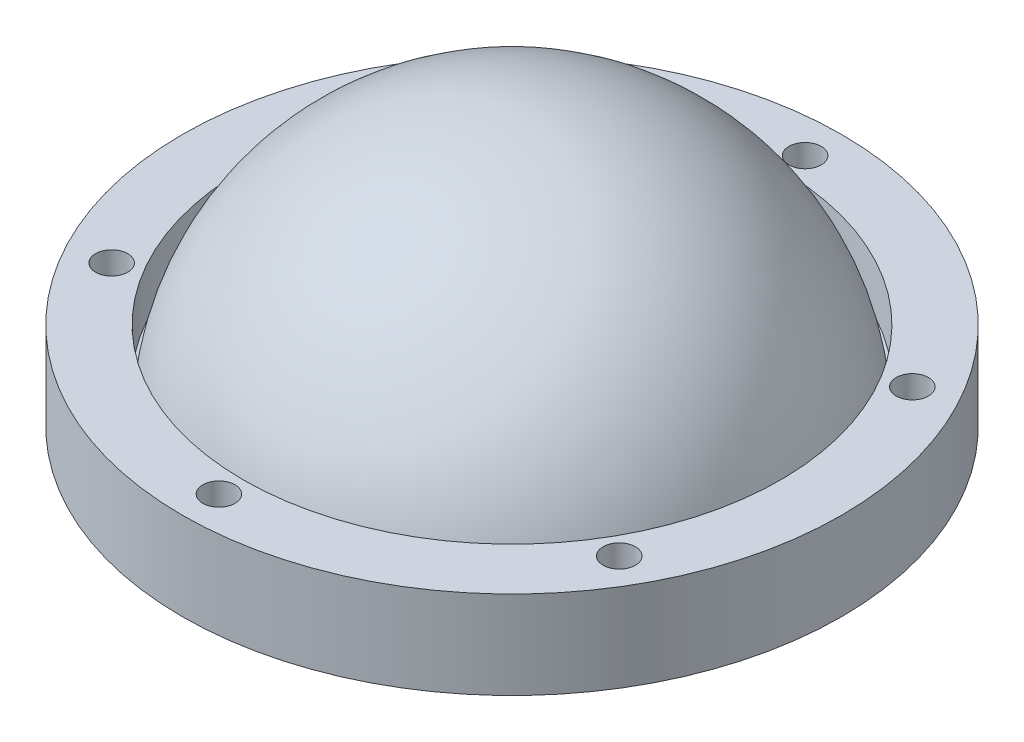
ISO-10303-21;
HEADER;
FILE_DESCRIPTION(('STEP AP214'),'2;1');
FILE_NAME('part.step','',(''),(''),'','','');
FILE_SCHEMA(('AUTOMOTIVE_DESIGN { 1 0 10303 214 1 1 1 1 }'));
ENDSEC;
DATA;
#1=APPLICATION_CONTEXT('core data for automotive mechanical design processes');
#2=APPLICATION_PROTOCOL_DEFINITION('international standard','automotive_design',2000,#1);
#3=PRODUCT_CONTEXT('',#1,'mechanical');
#4=PRODUCT('Part','Part','',(#3));
#5=PRODUCT_RELATED_PRODUCT_CATEGORY('part','',(#4));
#6=PRODUCT_DEFINITION_FORMATION('','',#4);
#7=PRODUCT_DEFINITION_CONTEXT('part definition',#1,'design');
#8=PRODUCT_DEFINITION('design','',#6,#7);
#9=PRODUCT_DEFINITION_SHAPE('','',#8);
#10=(LENGTH_UNIT() NAMED_UNIT(*) SI_UNIT(.MILLI.,.METRE.));
#11=(NAMED_UNIT(*) PLANE_ANGLE_UNIT() SI_UNIT($,.RADIAN.));
#12=(NAMED_UNIT(*) SI_UNIT($,.STERADIAN.) SOLID_ANGLE_UNIT());
#13=UNCERTAINTY_MEASURE_WITH_UNIT(LENGTH_MEASURE(1.E-05),#10,'distance_accuracy_value','');
#14=(GEOMETRIC_REPRESENTATION_CONTEXT(3) GLOBAL_UNCERTAINTY_ASSIGNED_CONTEXT((#13)) GLOBAL_UNIT_ASSIGNED_CONTEXT((#10,
#11,#12)) REPRESENTATION_CONTEXT('',''));
#15=CARTESIAN_POINT('',(0.,0.,0.));
#16=DIRECTION('',(0.,0.,1.));
#17=DIRECTION('',(1.,0.,0.));
#18=AXIS2_PLACEMENT_3D('',#15,#16,#17);
#19=CARTESIAN_POINT('',(0.,8.,0.));
#20=DIRECTION('',(0.,-1.,0.));
#21=DIRECTION('',(0.,0.,-1.));
#22=AXIS2_PLACEMENT_3D('',#19,#20,#21);
#23=CYLINDRICAL_SURFACE('',#22,67.5);
#24=CARTESIAN_POINT('',(0.,0.,0.));
#25=DIRECTION('',(0.,1.,0.));
#26=DIRECTION('',(0.,0.,1.));
#27=AXIS2_PLACEMENT_3D('',#24,#25,#26);
#28=CIRCLE('',#27,67.5);
#29=CARTESIAN_POINT('',(0.,0.,67.5));
#30=VERTEX_POINT('',#29);
#31=EDGE_CURVE('E58',#30,#30,#28,.T.);
#32=ORIENTED_EDGE('',*,*,#31,.T.);
#33=EDGE_LOOP('',(#32));
#34=FACE_BOUND('',#33,.T.);
#35=CARTESIAN_POINT('',(0.,18.,0.));
#36=DIRECTION('',(0.,1.,0.));
#37=DIRECTION('',(0.,0.,1.));
#38=AXIS2_PLACEMENT_3D('',#35,#36,#37);
#39=CIRCLE('',#38,67.5);
#40=CARTESIAN_POINT('',(0.,18.,67.5));
#41=VERTEX_POINT('',#40);
#42=EDGE_CURVE('E62',#41,#41,#39,.T.);
#43=ORIENTED_EDGE('',*,*,#42,.F.);
#44=EDGE_LOOP('',(#43));
#45=FACE_BOUND('',#44,.T.);
#46=ADVANCED_FACE('F41',(#34,#45),#23,.T.);
#47=CARTESIAN_POINT('',(-65.,0.,0.));
#48=DIRECTION('',(0.,1.,0.));
#49=DIRECTION('',(-1.,0.,0.));
#50=AXIS2_PLACEMENT_3D('',#47,#48,#49);
#51=PLANE('',#50);
#52=ORIENTED_EDGE('',*,*,#31,.F.);
#53=EDGE_LOOP('',(#52));
#54=FACE_BOUND('',#53,.T.);
#55=ADVANCED_FACE('F43',(#54),#51,.F.);
#56=CARTESIAN_POINT('',(0.,18.,0.));
#57=DIRECTION('',(0.,1.,0.));
#58=DIRECTION('',(0.,0.,1.));
#59=AXIS2_PLACEMENT_3D('',#56,#57,#58);
#60=PLANE('',#59);
#61=CARTESIAN_POINT('',(-51.961524227066,18.,30.0000000000006));
#62=DIRECTION('',(0.,1.,0.));
#63=DIRECTION('',(-0.866025403784433,0.,0.50000000000001));
#64=AXIS2_PLACEMENT_3D('',#61,#62,#63);
#65=CIRCLE('',#64,3.3);
#66=CARTESIAN_POINT('',(-54.8194080595546,18.,31.6500000000006));
#67=VERTEX_POINT('',#66);
#68=EDGE_CURVE('E81',#67,#67,#65,.T.);
#69=ORIENTED_EDGE('',*,*,#68,.F.);
#70=EDGE_LOOP('',(#69));
#71=FACE_BOUND('',#70,.T.);
#72=CARTESIAN_POINT('',(-51.9615242270666,18.,-29.9999999999995));
#73=DIRECTION('',(0.,1.,0.));
#74=DIRECTION('',(-0.866025403784443,0.,-0.499999999999992));
#75=AXIS2_PLACEMENT_3D('',#72,#73,#74);
#76=CIRCLE('',#75,3.3);
#77=CARTESIAN_POINT('',(-54.8194080595553,18.,-31.6499999999995));
#78=VERTEX_POINT('',#77);
#79=EDGE_CURVE('E87',#78,#78,#76,.T.);
#80=ORIENTED_EDGE('',*,*,#79,.F.);
#81=EDGE_LOOP('',(#80));
#82=FACE_BOUND('',#81,.T.);
#83=CARTESIAN_POINT('',(0.,18.,-60.));
#84=DIRECTION('',(0.,1.,0.));
#85=DIRECTION('',(0.,0.,-1.));
#86=AXIS2_PLACEMENT_3D('',#83,#84,#85);
#87=CIRCLE('',#86,3.3);
#88=CARTESIAN_POINT('',(0.,18.,-63.3));
#89=VERTEX_POINT('',#88);
#90=EDGE_CURVE('E93',#89,#89,#87,.T.);
#91=ORIENTED_EDGE('',*,*,#90,.F.);
#92=EDGE_LOOP('',(#91));
#93=FACE_BOUND('',#92,.T.);
#94=CARTESIAN_POINT('',(51.9615242270662,18.,-30.0000000000003));
#95=DIRECTION('',(0.,1.,0.));
#96=DIRECTION('',(0.866025403784436,0.,-0.500000000000004));
#97=AXIS2_PLACEMENT_3D('',#94,#95,#96);
#98=CIRCLE('',#97,3.3);
#99=CARTESIAN_POINT('',(54.8194080595548,18.,-31.6500000000003));
#100=VERTEX_POINT('',#99);
#101=EDGE_CURVE('E99',#100,#100,#98,.T.);
#102=ORIENTED_EDGE('',*,*,#101,.F.);
#103=EDGE_LOOP('',(#102));
#104=FACE_BOUND('',#103,.T.);
#105=CARTESIAN_POINT('',(51.9615242270664,18.,29.9999999999999));
#106=DIRECTION('',(0.,1.,0.));
#107=DIRECTION('',(0.86602540378444,0.,0.499999999999998));
#108=AXIS2_PLACEMENT_3D('',#105,#106,#107);
#109=CIRCLE('',#108,3.3);
#110=CARTESIAN_POINT('',(54.8194080595551,18.,31.6499999999999));
#111=VERTEX_POINT('',#110);
#112=EDGE_CURVE('E75',#111,#111,#109,.T.);
#113=ORIENTED_EDGE('',*,*,#112,.F.);
#114=EDGE_LOOP('',(#113));
#115=FACE_BOUND('',#114,.T.);
#116=CARTESIAN_POINT('',(0.,18.,60.));
#117=DIRECTION('',(0.,1.,0.));
#118=DIRECTION('',(0.,0.,1.));
#119=AXIS2_PLACEMENT_3D('',#116,#117,#118);
#120=CIRCLE('',#119,3.3);
#121=CARTESIAN_POINT('',(0.,18.,63.3));
#122=VERTEX_POINT('',#121);
#123=EDGE_CURVE('E69',#122,#122,#120,.T.);
#124=ORIENTED_EDGE('',*,*,#123,.F.);
#125=EDGE_LOOP('',(#124));
#126=FACE_BOUND('',#125,.T.);
#127=ORIENTED_EDGE('',*,*,#42,.T.);
#128=EDGE_LOOP('',(#127));
#129=FACE_BOUND('',#128,.T.);
#130=CARTESIAN_POINT('',(0.,18.,0.));
#131=DIRECTION('',(0.,1.,0.));
#132=DIRECTION('',(0.,0.,1.));
#133=AXIS2_PLACEMENT_3D('',#130,#131,#132);
#134=CIRCLE('',#133,55.);
#135=CARTESIAN_POINT('',(0.,18.,55.));
#136=VERTEX_POINT('',#135);
#137=EDGE_CURVE('E65',#136,#136,#134,.T.);
#138=ORIENTED_EDGE('',*,*,#137,.F.);
#139=EDGE_LOOP('',(#138));
#140=FACE_BOUND('',#139,.T.);
#141=ADVANCED_FACE('F114',(#71,#82,#93,#104,#115,#126,#129,#140),#60,.T.);
#142=CARTESIAN_POINT('',(0.,18.,0.));
#143=DIRECTION('',(0.,-1.,0.));
#144=DIRECTION('',(0.,0.,-1.));
#145=AXIS2_PLACEMENT_3D('',#142,#143,#144);
#146=CYLINDRICAL_SURFACE('',#145,55.);
#147=ORIENTED_EDGE('',*,*,#137,.T.);
#148=EDGE_LOOP('',(#147));
#149=FACE_BOUND('',#148,.T.);
#150=CARTESIAN_POINT('',(0.,8.,0.));
#151=DIRECTION('',(0.,1.,0.));
#152=DIRECTION('',(0.,0.,1.));
#153=AXIS2_PLACEMENT_3D('',#150,#151,#152);
#154=CIRCLE('',#153,55.);
#155=CARTESIAN_POINT('',(0.,8.,55.));
#156=VERTEX_POINT('',#155);
#157=EDGE_CURVE('E11',#156,#156,#154,.F.);
#158=ORIENTED_EDGE('',*,*,#157,.T.);
#159=EDGE_LOOP('',(#158));
#160=FACE_BOUND('',#159,.T.);
#161=ADVANCED_FACE('F117',(#149,#160),#146,.F.);
#162=CARTESIAN_POINT('',(0.,0.,0.));
#163=DIRECTION('',(0.,-1.,0.));
#164=DIRECTION('',(1.,0.,0.));
#165=AXIS2_PLACEMENT_3D('',#162,#163,#164);
#166=SPHERICAL_SURFACE('',#165,55.);
#167=CARTESIAN_POINT('',(0.,8.,0.));
#168=DIRECTION('',(0.,1.,0.));
#169=DIRECTION('',(0.,0.,1.));
#170=AXIS2_PLACEMENT_3D('',#167,#168,#169);
#171=CIRCLE('',#170,54.4150714416512);
#172=CARTESIAN_POINT('',(0.,8.,54.4150714416512));
#173=VERTEX_POINT('',#172);
#174=EDGE_CURVE('E53',#173,#173,#171,.T.);
#175=ORIENTED_EDGE('',*,*,#174,.T.);
#176=EDGE_LOOP('',(#175));
#177=FACE_BOUND('',#176,.T.);
#178=ADVANCED_FACE('F129',(#177),#166,.T.);
#179=CARTESIAN_POINT('',(0.,8.,0.));
#180=DIRECTION('',(0.,1.,0.));
#181=DIRECTION('',(0.,0.,1.));
#182=AXIS2_PLACEMENT_3D('',#179,#180,#181);
#183=PLANE('',#182);
#184=ORIENTED_EDGE('',*,*,#174,.F.);
#185=EDGE_LOOP('',(#184));
#186=FACE_BOUND('',#185,.T.);
#187=ORIENTED_EDGE('',*,*,#157,.F.);
#188=EDGE_LOOP('',(#187));
#189=FACE_BOUND('',#188,.T.);
#190=ADVANCED_FACE('F134',(#186,#189),#183,.T.);
#191=CARTESIAN_POINT('',(0.,3.,60.));
#192=DIRECTION('',(0.,1.,0.));
#193=DIRECTION('',(0.,0.,1.));
#194=AXIS2_PLACEMENT_3D('',#191,#192,#193);
#195=CYLINDRICAL_SURFACE('',#194,3.3);
#196=CARTESIAN_POINT('',(0.,3.,60.));
#197=DIRECTION('',(0.,1.,0.));
#198=DIRECTION('',(0.,0.,1.));
#199=AXIS2_PLACEMENT_3D('',#196,#197,#198);
#200=CIRCLE('',#199,3.3);
#201=CARTESIAN_POINT('',(0.,3.,63.3));
#202=VERTEX_POINT('',#201);
#203=EDGE_CURVE('E68',#202,#202,#200,.T.);
#204=ORIENTED_EDGE('',*,*,#203,.F.);
#205=EDGE_LOOP('',(#204));
#206=FACE_BOUND('',#205,.T.);
#207=ORIENTED_EDGE('',*,*,#123,.T.);
#208=EDGE_LOOP('',(#207));
#209=FACE_BOUND('',#208,.T.);
#210=ADVANCED_FACE('F159',(#206,#209),#195,.F.);
#211=CARTESIAN_POINT('',(0.,3.,60.));
#212=DIRECTION('',(0.,1.,0.));
#213=DIRECTION('',(0.,0.,1.));
#214=AXIS2_PLACEMENT_3D('',#211,#212,#213);
#215=PLANE('',#214);
#216=ORIENTED_EDGE('',*,*,#203,.T.);
#217=EDGE_LOOP('',(#216));
#218=FACE_BOUND('',#217,.T.);
#219=ADVANCED_FACE('F164',(#218),#215,.T.);
#220=CARTESIAN_POINT('',(51.9615242270664,3.,29.9999999999999));
#221=DIRECTION('',(0.,1.,0.));
#222=DIRECTION('',(0.,0.,1.));
#223=AXIS2_PLACEMENT_3D('',#220,#221,#222);
#224=CYLINDRICAL_SURFACE('',#223,3.3);
#225=CARTESIAN_POINT('',(51.9615242270664,3.,29.9999999999999));
#226=DIRECTION('',(0.,1.,0.));
#227=DIRECTION('',(0.86602540378444,0.,0.499999999999998));
#228=AXIS2_PLACEMENT_3D('',#225,#226,#227);
#229=CIRCLE('',#228,3.3);
#230=CARTESIAN_POINT('',(54.8194080595551,3.,31.6499999999999));
#231=VERTEX_POINT('',#230);
#232=EDGE_CURVE('E72',#231,#231,#229,.T.);
#233=ORIENTED_EDGE('',*,*,#232,.F.);
#234=EDGE_LOOP('',(#233));
#235=FACE_BOUND('',#234,.T.);
#236=ORIENTED_EDGE('',*,*,#112,.T.);
#237=EDGE_LOOP('',(#236));
#238=FACE_BOUND('',#237,.T.);
#239=ADVANCED_FACE('F171',(#235,#238),#224,.F.);
#240=CARTESIAN_POINT('',(51.9615242270664,3.,29.9999999999999));
#241=DIRECTION('',(0.,1.,0.));
#242=DIRECTION('',(0.86602540378444,0.,0.499999999999998));
#243=AXIS2_PLACEMENT_3D('',#240,#241,#242);
#244=PLANE('',#243);
#245=ORIENTED_EDGE('',*,*,#232,.T.);
#246=EDGE_LOOP('',(#245));
#247=FACE_BOUND('',#246,.T.);
#248=ADVANCED_FACE('F110',(#247),#244,.T.);
#249=CARTESIAN_POINT('',(51.9615242270662,3.,-30.0000000000003));
#250=DIRECTION('',(0.,1.,0.));
#251=DIRECTION('',(0.,0.,1.));
#252=AXIS2_PLACEMENT_3D('',#249,#250,#251);
#253=CYLINDRICAL_SURFACE('',#252,3.3);
#254=CARTESIAN_POINT('',(51.9615242270662,3.,-30.0000000000003));
#255=DIRECTION('',(0.,1.,0.));
#256=DIRECTION('',(0.866025403784436,0.,-0.500000000000004));
#257=AXIS2_PLACEMENT_3D('',#254,#255,#256);
#258=CIRCLE('',#257,3.3);
#259=CARTESIAN_POINT('',(54.8194080595548,3.,-31.6500000000003));
#260=VERTEX_POINT('',#259);
#261=EDGE_CURVE('E78',#260,#260,#258,.T.);
#262=ORIENTED_EDGE('',*,*,#261,.F.);
#263=EDGE_LOOP('',(#262));
#264=FACE_BOUND('',#263,.T.);
#265=ORIENTED_EDGE('',*,*,#101,.T.);
#266=EDGE_LOOP('',(#265));
#267=FACE_BOUND('',#266,.T.);
#268=ADVANCED_FACE('F107',(#264,#267),#253,.F.);
#269=CARTESIAN_POINT('',(51.9615242270662,3.,-30.0000000000003));
#270=DIRECTION('',(0.,1.,0.));
#271=DIRECTION('',(0.866025403784436,0.,-0.500000000000004));
#272=AXIS2_PLACEMENT_3D('',#269,#270,#271);
#273=PLANE('',#272);
#274=ORIENTED_EDGE('',*,*,#261,.T.);
#275=EDGE_LOOP('',(#274));
#276=FACE_BOUND('',#275,.T.);
#277=ADVANCED_FACE('F105',(#276),#273,.T.);
#278=CARTESIAN_POINT('',(0.,3.,-60.));
#279=DIRECTION('',(0.,1.,0.));
#280=DIRECTION('',(0.,0.,1.));
#281=AXIS2_PLACEMENT_3D('',#278,#279,#280);
#282=CYLINDRICAL_SURFACE('',#281,3.3);
#283=CARTESIAN_POINT('',(0.,3.,-60.));
#284=DIRECTION('',(0.,1.,0.));
#285=DIRECTION('',(0.,0.,-1.));
#286=AXIS2_PLACEMENT_3D('',#283,#284,#285);
#287=CIRCLE('',#286,3.3);
#288=CARTESIAN_POINT('',(0.,3.,-63.3));
#289=VERTEX_POINT('',#288);
#290=EDGE_CURVE('E96',#289,#289,#287,.T.);
#291=ORIENTED_EDGE('',*,*,#290,.F.);
#292=EDGE_LOOP('',(#291));
#293=FACE_BOUND('',#292,.T.);
#294=ORIENTED_EDGE('',*,*,#90,.T.);
#295=EDGE_LOOP('',(#294));
#296=FACE_BOUND('',#295,.T.);
#297=ADVANCED_FACE('F199',(#293,#296),#282,.F.);
#298=CARTESIAN_POINT('',(0.,3.,-60.));
#299=DIRECTION('',(0.,1.,0.));
#300=DIRECTION('',(0.,0.,-1.));
#301=AXIS2_PLACEMENT_3D('',#298,#299,#300);
#302=PLANE('',#301);
#303=ORIENTED_EDGE('',*,*,#290,.T.);
#304=EDGE_LOOP('',(#303));
#305=FACE_BOUND('',#304,.T.);
#306=ADVANCED_FACE('F194',(#305),#302,.T.);
#307=CARTESIAN_POINT('',(-51.9615242270666,3.,-29.9999999999995));
#308=DIRECTION('',(0.,1.,0.));
#309=DIRECTION('',(0.,0.,1.));
#310=AXIS2_PLACEMENT_3D('',#307,#308,#309);
#311=CYLINDRICAL_SURFACE('',#310,3.3);
#312=CARTESIAN_POINT('',(-51.9615242270666,3.,-29.9999999999995));
#313=DIRECTION('',(0.,1.,0.));
#314=DIRECTION('',(-0.866025403784443,0.,-0.499999999999992));
#315=AXIS2_PLACEMENT_3D('',#312,#313,#314);
#316=CIRCLE('',#315,3.3);
#317=CARTESIAN_POINT('',(-54.8194080595553,3.,-31.6499999999995));
#318=VERTEX_POINT('',#317);
#319=EDGE_CURVE('E90',#318,#318,#316,.T.);
#320=ORIENTED_EDGE('',*,*,#319,.F.);
#321=EDGE_LOOP('',(#320));
#322=FACE_BOUND('',#321,.T.);
#323=ORIENTED_EDGE('',*,*,#79,.T.);
#324=EDGE_LOOP('',(#323));
#325=FACE_BOUND('',#324,.T.);
#326=ADVANCED_FACE('F191',(#322,#325),#311,.F.);
#327=CARTESIAN_POINT('',(-51.9615242270666,3.,-29.9999999999995));
#328=DIRECTION('',(0.,1.,0.));
#329=DIRECTION('',(-0.866025403784443,0.,-0.499999999999992));
#330=AXIS2_PLACEMENT_3D('',#327,#328,#329);
#331=PLANE('',#330);
#332=ORIENTED_EDGE('',*,*,#319,.T.);
#333=EDGE_LOOP('',(#332));
#334=FACE_BOUND('',#333,.T.);
#335=ADVANCED_FACE('F187',(#334),#331,.T.);
#336=CARTESIAN_POINT('',(-51.961524227066,3.,30.0000000000006));
#337=DIRECTION('',(0.,1.,0.));
#338=DIRECTION('',(0.,0.,1.));
#339=AXIS2_PLACEMENT_3D('',#336,#337,#338);
#340=CYLINDRICAL_SURFACE('',#339,3.3);
#341=CARTESIAN_POINT('',(-51.961524227066,3.,30.0000000000006));
#342=DIRECTION('',(0.,1.,0.));
#343=DIRECTION('',(-0.866025403784433,0.,0.50000000000001));
#344=AXIS2_PLACEMENT_3D('',#341,#342,#343);
#345=CIRCLE('',#344,3.3);
#346=CARTESIAN_POINT('',(-54.8194080595546,3.,31.6500000000006));
#347=VERTEX_POINT('',#346);
#348=EDGE_CURVE('E84',#347,#347,#345,.T.);
#349=ORIENTED_EDGE('',*,*,#348,.F.);
#350=EDGE_LOOP('',(#349));
#351=FACE_BOUND('',#350,.T.);
#352=ORIENTED_EDGE('',*,*,#68,.T.);
#353=EDGE_LOOP('',(#352));
#354=FACE_BOUND('',#353,.T.);
#355=ADVANCED_FACE('F183',(#351,#354),#340,.F.);
#356=CARTESIAN_POINT('',(-51.961524227066,3.,30.0000000000006));
#357=DIRECTION('',(0.,1.,0.));
#358=DIRECTION('',(-0.866025403784433,0.,0.50000000000001));
#359=AXIS2_PLACEMENT_3D('',#356,#357,#358);
#360=PLANE('',#359);
#361=ORIENTED_EDGE('',*,*,#348,.T.);
#362=EDGE_LOOP('',(#361));
#363=FACE_BOUND('',#362,.T.);
#364=ADVANCED_FACE('F186',(#363),#360,.T.);
#365=CLOSED_SHELL('',(#46,#55,#141,#161,#178,#190,#210,#219,#239,#248,#268,#277,#297,#306,#326,
#335,#355,#364));
#366=CARTESIAN_POINT('',(0.,0.,0.));
#367=DIRECTION('',(0.,-1.,0.));
#368=DIRECTION('',(-1.,0.,0.));
#369=AXIS2_PLACEMENT_3D('',#366,#367,#368);
#370=SPHERICAL_SURFACE('',#369,50.);
#371=CARTESIAN_POINT('',(0.,8.,0.));
#372=DIRECTION('',(0.,1.,0.));
#373=DIRECTION('',(0.,0.,1.));
#374=AXIS2_PLACEMENT_3D('',#371,#372,#373);
#375=CIRCLE('',#374,49.3558507170123);
#376=CARTESIAN_POINT('',(0.,8.,49.3558507170123));
#377=VERTEX_POINT('',#376);
#378=EDGE_CURVE('E49',#377,#377,#375,.F.);
#379=ORIENTED_EDGE('',*,*,#378,.T.);
#380=EDGE_LOOP('',(#379));
#381=FACE_BOUND('',#380,.T.);
#382=ADVANCED_FACE('F147',(#381),#370,.F.);
#383=ORIENTED_EDGE('',*,*,#378,.F.);
#384=EDGE_LOOP('',(#383));
#385=FACE_BOUND('',#384,.T.);
#386=ADVANCED_FACE('F149',(#385),#183,.T.);
#387=CLOSED_SHELL('',(#382,#386));
#388=ORIENTED_CLOSED_SHELL('',*,#387,.T.);
#389=BREP_WITH_VOIDS('B2',#365,(#388));
#390=ADVANCED_BREP_SHAPE_REPRESENTATION('',(#18,#389),#14);
#391=SHAPE_DEFINITION_REPRESENTATION(#9,#390);
ENDSEC;
END-ISO-10303-21;
